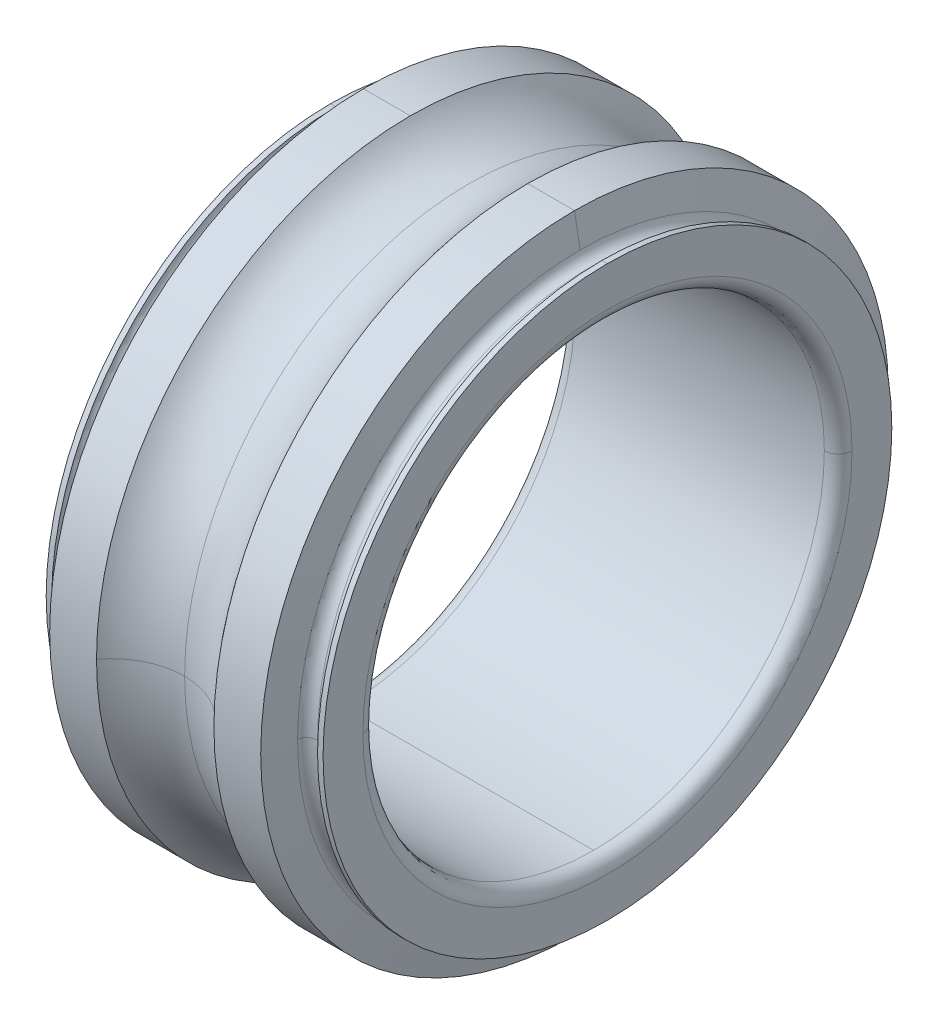
ISO-10303-21;
HEADER;
FILE_DESCRIPTION(('STEP AP214'),'2;1');
FILE_NAME('part.step','',(''),(''),'','','');
FILE_SCHEMA(('AUTOMOTIVE_DESIGN { 1 0 10303 214 1 1 1 1 }'));
ENDSEC;
DATA;
#1=APPLICATION_CONTEXT('core data for automotive mechanical design processes');
#2=APPLICATION_PROTOCOL_DEFINITION('international standard','automotive_design',2000,#1);
#3=PRODUCT_CONTEXT('',#1,'mechanical');
#4=PRODUCT('Part','Part','',(#3));
#5=PRODUCT_RELATED_PRODUCT_CATEGORY('part','',(#4));
#6=PRODUCT_DEFINITION_FORMATION('','',#4);
#7=PRODUCT_DEFINITION_CONTEXT('part definition',#1,'design');
#8=PRODUCT_DEFINITION('design','',#6,#7);
#9=PRODUCT_DEFINITION_SHAPE('','',#8);
#10=(LENGTH_UNIT() NAMED_UNIT(*) SI_UNIT(.MILLI.,.METRE.));
#11=(NAMED_UNIT(*) PLANE_ANGLE_UNIT() SI_UNIT($,.RADIAN.));
#12=(NAMED_UNIT(*) SI_UNIT($,.STERADIAN.) SOLID_ANGLE_UNIT());
#13=UNCERTAINTY_MEASURE_WITH_UNIT(LENGTH_MEASURE(1.E-05),#10,'distance_accuracy_value','');
#14=(GEOMETRIC_REPRESENTATION_CONTEXT(3) GLOBAL_UNCERTAINTY_ASSIGNED_CONTEXT((#13)) GLOBAL_UNIT_ASSIGNED_CONTEXT((#10,
#11,#12)) REPRESENTATION_CONTEXT('',''));
#15=CARTESIAN_POINT('',(0.,0.,0.));
#16=DIRECTION('',(0.,0.,1.));
#17=DIRECTION('',(1.,0.,0.));
#18=AXIS2_PLACEMENT_3D('',#15,#16,#17);
#19=CARTESIAN_POINT('',(9.55827575048552,0.,0.));
#20=DIRECTION('',(1.,0.,0.));
#21=DIRECTION('',(0.,1.,0.));
#22=AXIS2_PLACEMENT_3D('',#19,#20,#21);
#23=CYLINDRICAL_SURFACE('',#22,13.6);
#24=DIRECTION('',(1.,0.,0.));
#25=VECTOR('',#24,1.);
#26=CARTESIAN_POINT('',(9.55827575048552,13.6,0.));
#27=LINE('',#26,#25);
#28=CARTESIAN_POINT('',(8.54374232185572,13.6,0.));
#29=VERTEX_POINT('',#28);
#30=CARTESIAN_POINT('',(10.5728091791153,13.6,0.));
#31=VERTEX_POINT('',#30);
#32=EDGE_CURVE('E295',#29,#31,#27,.T.);
#33=ORIENTED_EDGE('',*,*,#32,.T.);
#34=CARTESIAN_POINT('',(10.5728091791153,0.,0.));
#35=DIRECTION('',(1.,0.,0.));
#36=DIRECTION('',(0.,1.,0.));
#37=AXIS2_PLACEMENT_3D('',#34,#35,#36);
#38=CIRCLE('',#37,13.6);
#39=CARTESIAN_POINT('',(10.5728091791153,-13.6,0.));
#40=VERTEX_POINT('',#39);
#41=EDGE_CURVE('E229',#40,#31,#38,.T.);
#42=ORIENTED_EDGE('',*,*,#41,.F.);
#43=DIRECTION('',(-1.,0.,0.));
#44=VECTOR('',#43,1.);
#45=CARTESIAN_POINT('',(9.55827575048552,-13.6,0.));
#46=LINE('',#45,#44);
#47=CARTESIAN_POINT('',(8.54374232185572,-13.6,0.));
#48=VERTEX_POINT('',#47);
#49=EDGE_CURVE('E298',#40,#48,#46,.T.);
#50=ORIENTED_EDGE('',*,*,#49,.T.);
#51=CARTESIAN_POINT('',(8.54374232185572,0.,0.));
#52=DIRECTION('',(1.,0.,0.));
#53=DIRECTION('',(0.,1.,0.));
#54=AXIS2_PLACEMENT_3D('',#51,#52,#53);
#55=CIRCLE('',#54,13.6);
#56=CARTESIAN_POINT('',(8.54374232185572,0.,-13.6));
#57=VERTEX_POINT('',#56);
#58=EDGE_CURVE('E205',#48,#57,#55,.T.);
#59=ORIENTED_EDGE('',*,*,#58,.T.);
#60=CARTESIAN_POINT('',(8.54374232185572,0.,0.));
#61=DIRECTION('',(1.,0.,0.));
#62=DIRECTION('',(0.,1.,0.));
#63=AXIS2_PLACEMENT_3D('',#60,#61,#62);
#64=CIRCLE('',#63,13.6);
#65=EDGE_CURVE('E236',#57,#29,#64,.T.);
#66=ORIENTED_EDGE('',*,*,#65,.T.);
#67=EDGE_LOOP('',(#33,#42,#50,#59,#66));
#68=FACE_BOUND('',#67,.T.);
#69=ADVANCED_FACE('F16',(#68),#23,.T.);
#70=CARTESIAN_POINT('',(6.,0.,0.));
#71=DIRECTION('',(1.,0.,0.));
#72=DIRECTION('',(0.,0.,-1.));
#73=AXIS2_PLACEMENT_3D('',#70,#71,#72);
#74=TOROIDAL_SURFACE('',#73,15.5,3.175);
#75=CARTESIAN_POINT('',(6.,0.,0.));
#76=DIRECTION('',(-1.,0.,0.));
#77=DIRECTION('',(0.,0.,1.));
#78=AXIS2_PLACEMENT_3D('',#75,#76,#77);
#79=CIRCLE('',#78,12.325);
#80=CARTESIAN_POINT('',(6.,0.,12.325));
#81=VERTEX_POINT('',#80);
#82=CARTESIAN_POINT('',(6.,0.,-12.325));
#83=VERTEX_POINT('',#82);
#84=EDGE_CURVE('E187',#81,#83,#79,.T.);
#85=ORIENTED_EDGE('',*,*,#84,.T.);
#86=CARTESIAN_POINT('',(6.,0.,-15.5));
#87=DIRECTION('',(0.,-1.,0.));
#88=DIRECTION('',(0.,0.,-1.));
#89=AXIS2_PLACEMENT_3D('',#86,#87,#88);
#90=CIRCLE('',#89,3.175);
#91=CARTESIAN_POINT('',(3.45625767814427,0.,-13.6));
#92=VERTEX_POINT('',#91);
#93=EDGE_CURVE('E201',#83,#92,#90,.T.);
#94=ORIENTED_EDGE('',*,*,#93,.T.);
#95=CARTESIAN_POINT('',(3.45625767814427,0.,0.));
#96=DIRECTION('',(1.,0.,0.));
#97=DIRECTION('',(0.,1.,0.));
#98=AXIS2_PLACEMENT_3D('',#95,#96,#97);
#99=CIRCLE('',#98,13.6);
#100=CARTESIAN_POINT('',(3.45625767814427,13.6,0.));
#101=VERTEX_POINT('',#100);
#102=EDGE_CURVE('E11',#92,#101,#99,.T.);
#103=ORIENTED_EDGE('',*,*,#102,.T.);
#104=CARTESIAN_POINT('',(3.45625767814427,0.,0.));
#105=DIRECTION('',(1.,0.,0.));
#106=DIRECTION('',(0.,1.,0.));
#107=AXIS2_PLACEMENT_3D('',#104,#105,#106);
#108=CIRCLE('',#107,13.6);
#109=CARTESIAN_POINT('',(3.45625767814427,0.,13.6));
#110=VERTEX_POINT('',#109);
#111=EDGE_CURVE('E189',#101,#110,#108,.T.);
#112=ORIENTED_EDGE('',*,*,#111,.T.);
#113=CARTESIAN_POINT('',(6.,0.,15.5));
#114=DIRECTION('',(0.,-1.,0.));
#115=DIRECTION('',(0.,0.,1.));
#116=AXIS2_PLACEMENT_3D('',#113,#114,#115);
#117=CIRCLE('',#116,3.175);
#118=EDGE_CURVE('E182',#110,#81,#117,.T.);
#119=ORIENTED_EDGE('',*,*,#118,.T.);
#120=EDGE_LOOP('',(#85,#94,#103,#112,#119));
#121=FACE_BOUND('',#120,.T.);
#122=ADVANCED_FACE('F184',(#121),#74,.F.);
#123=CARTESIAN_POINT('',(2.44172424951447,0.,0.));
#124=DIRECTION('',(1.,0.,0.));
#125=DIRECTION('',(0.,1.,0.));
#126=AXIS2_PLACEMENT_3D('',#123,#124,#125);
#127=CYLINDRICAL_SURFACE('',#126,13.6);
#128=DIRECTION('',(1.,0.,0.));
#129=VECTOR('',#128,1.);
#130=CARTESIAN_POINT('',(2.44172424951447,13.6,0.));
#131=LINE('',#130,#129);
#132=CARTESIAN_POINT('',(1.42719082088468,13.6,0.));
#133=VERTEX_POINT('',#132);
#134=EDGE_CURVE('E319',#133,#101,#131,.T.);
#135=ORIENTED_EDGE('',*,*,#134,.T.);
#136=ORIENTED_EDGE('',*,*,#102,.F.);
#137=CARTESIAN_POINT('',(3.45625767814427,0.,0.));
#138=DIRECTION('',(1.,0.,0.));
#139=DIRECTION('',(0.,1.,0.));
#140=AXIS2_PLACEMENT_3D('',#137,#138,#139);
#141=CIRCLE('',#140,13.6);
#142=CARTESIAN_POINT('',(3.45625767814427,-13.6,0.));
#143=VERTEX_POINT('',#142);
#144=EDGE_CURVE('E309',#143,#92,#141,.T.);
#145=ORIENTED_EDGE('',*,*,#144,.F.);
#146=DIRECTION('',(-1.,0.,0.));
#147=VECTOR('',#146,1.);
#148=CARTESIAN_POINT('',(2.44172424951447,-13.6,0.));
#149=LINE('',#148,#147);
#150=CARTESIAN_POINT('',(1.42719082088468,-13.6,0.));
#151=VERTEX_POINT('',#150);
#152=EDGE_CURVE('E325',#143,#151,#149,.T.);
#153=ORIENTED_EDGE('',*,*,#152,.T.);
#154=CARTESIAN_POINT('',(1.42719082088468,0.,0.));
#155=DIRECTION('',(1.,0.,0.));
#156=DIRECTION('',(0.,1.,0.));
#157=AXIS2_PLACEMENT_3D('',#154,#155,#156);
#158=CIRCLE('',#157,13.6);
#159=EDGE_CURVE('E24',#151,#133,#158,.T.);
#160=ORIENTED_EDGE('',*,*,#159,.T.);
#161=EDGE_LOOP('',(#135,#136,#145,#153,#160));
#162=FACE_BOUND('',#161,.T.);
#163=ADVANCED_FACE('F433',(#162),#127,.T.);
#164=CARTESIAN_POINT('',(1.30746446341226,0.,0.));
#165=DIRECTION('',(1.,0.,0.));
#166=DIRECTION('',(0.,1.,0.));
#167=AXIS2_PLACEMENT_3D('',#164,#165,#166);
#168=CONICAL_SURFACE('',#167,12.9209980855376,1.39626340159546);
#169=DIRECTION('',(0.17364817766693,0.984807753012208,0.));
#170=VECTOR('',#169,1.);
#171=CARTESIAN_POINT('',(1.30746446341226,12.9209980855376,0.));
#172=LINE('',#171,#170);
#173=CARTESIAN_POINT('',(1.18773810593984,12.2419961710752,0.));
#174=VERTEX_POINT('',#173);
#175=EDGE_CURVE('E334',#174,#133,#172,.T.);
#176=ORIENTED_EDGE('',*,*,#175,.T.);
#177=ORIENTED_EDGE('',*,*,#159,.F.);
#178=DIRECTION('',(-0.17364817766693,0.984807753012208,0.));
#179=VECTOR('',#178,1.);
#180=CARTESIAN_POINT('',(1.30746446341226,-12.9209980855376,0.));
#181=LINE('',#180,#179);
#182=CARTESIAN_POINT('',(1.18773810593984,-12.2419961710752,0.));
#183=VERTEX_POINT('',#182);
#184=EDGE_CURVE('E337',#151,#183,#181,.T.);
#185=ORIENTED_EDGE('',*,*,#184,.T.);
#186=CARTESIAN_POINT('',(1.18773810593984,0.,0.));
#187=DIRECTION('',(1.,0.,0.));
#188=DIRECTION('',(0.,1.,0.));
#189=AXIS2_PLACEMENT_3D('',#186,#187,#188);
#190=CIRCLE('',#189,12.2419961710752);
#191=CARTESIAN_POINT('',(1.18773810593984,0.,-12.2419961710752));
#192=VERTEX_POINT('',#191);
#193=EDGE_CURVE('E276',#183,#192,#190,.T.);
#194=ORIENTED_EDGE('',*,*,#193,.T.);
#195=CARTESIAN_POINT('',(1.18773810593984,0.,0.));
#196=DIRECTION('',(1.,0.,0.));
#197=DIRECTION('',(0.,1.,0.));
#198=AXIS2_PLACEMENT_3D('',#195,#196,#197);
#199=CIRCLE('',#198,12.2419961710752);
#200=EDGE_CURVE('E258',#192,#174,#199,.T.);
#201=ORIENTED_EDGE('',*,*,#200,.T.);
#202=EDGE_LOOP('',(#176,#177,#185,#194,#201));
#203=FACE_BOUND('',#202,.T.);
#204=ADVANCED_FACE('F426',(#203),#168,.T.);
#205=CARTESIAN_POINT('',(0.717,0.,0.));
#206=DIRECTION('',(1.,0.,0.));
#207=DIRECTION('',(0.,0.,-1.));
#208=AXIS2_PLACEMENT_3D('',#205,#206,#207);
#209=TOROIDAL_SURFACE('',#208,12.325,0.478);
#210=CARTESIAN_POINT('',(0.717,0.,0.));
#211=DIRECTION('',(-1.,0.,0.));
#212=DIRECTION('',(0.,0.,1.));
#213=AXIS2_PLACEMENT_3D('',#210,#211,#212);
#214=CIRCLE('',#213,11.847);
#215=CARTESIAN_POINT('',(0.717,0.,11.847));
#216=VERTEX_POINT('',#215);
#217=CARTESIAN_POINT('',(0.717,0.,-11.847));
#218=VERTEX_POINT('',#217);
#219=EDGE_CURVE('E249',#216,#218,#214,.T.);
#220=ORIENTED_EDGE('',*,*,#219,.T.);
#221=CARTESIAN_POINT('',(0.717,0.,-12.325));
#222=DIRECTION('',(0.,-1.,0.));
#223=DIRECTION('',(0.,0.,-1.));
#224=AXIS2_PLACEMENT_3D('',#221,#222,#223);
#225=CIRCLE('',#224,0.478);
#226=CARTESIAN_POINT('',(0.239,0.,-12.325));
#227=VERTEX_POINT('',#226);
#228=EDGE_CURVE('E351',#218,#227,#225,.T.);
#229=ORIENTED_EDGE('',*,*,#228,.T.);
#230=CARTESIAN_POINT('',(0.239,0.,0.));
#231=DIRECTION('',(1.,0.,0.));
#232=DIRECTION('',(0.,1.,0.));
#233=AXIS2_PLACEMENT_3D('',#230,#231,#232);
#234=CIRCLE('',#233,12.325);
#235=CARTESIAN_POINT('',(0.239,12.325,0.));
#236=VERTEX_POINT('',#235);
#237=EDGE_CURVE('E19',#227,#236,#234,.T.);
#238=ORIENTED_EDGE('',*,*,#237,.T.);
#239=CARTESIAN_POINT('',(0.239,0.,0.));
#240=DIRECTION('',(1.,0.,0.));
#241=DIRECTION('',(0.,1.,0.));
#242=AXIS2_PLACEMENT_3D('',#239,#240,#241);
#243=CIRCLE('',#242,12.325);
#244=CARTESIAN_POINT('',(0.239,0.,12.325));
#245=VERTEX_POINT('',#244);
#246=EDGE_CURVE('E363',#236,#245,#243,.T.);
#247=ORIENTED_EDGE('',*,*,#246,.T.);
#248=CARTESIAN_POINT('',(0.717,0.,12.325));
#249=DIRECTION('',(0.,-1.,0.));
#250=DIRECTION('',(0.,0.,1.));
#251=AXIS2_PLACEMENT_3D('',#248,#249,#250);
#252=CIRCLE('',#251,0.478);
#253=EDGE_CURVE('E339',#245,#216,#252,.T.);
#254=ORIENTED_EDGE('',*,*,#253,.T.);
#255=EDGE_LOOP('',(#220,#229,#238,#247,#254));
#256=FACE_BOUND('',#255,.T.);
#257=ADVANCED_FACE('F407',(#256),#209,.F.);
#258=CARTESIAN_POINT('',(0.1195,0.,0.));
#259=DIRECTION('',(1.,0.,0.));
#260=DIRECTION('',(0.,1.,0.));
#261=AXIS2_PLACEMENT_3D('',#258,#259,#260);
#262=CYLINDRICAL_SURFACE('',#261,12.325);
#263=DIRECTION('',(1.,0.,0.));
#264=VECTOR('',#263,1.);
#265=CARTESIAN_POINT('',(0.1195,12.325,0.));
#266=LINE('',#265,#264);
#267=CARTESIAN_POINT('',(0.,12.325,0.));
#268=VERTEX_POINT('',#267);
#269=EDGE_CURVE('E354',#268,#236,#266,.T.);
#270=ORIENTED_EDGE('',*,*,#269,.T.);
#271=ORIENTED_EDGE('',*,*,#237,.F.);
#272=CARTESIAN_POINT('',(0.239,0.,0.));
#273=DIRECTION('',(1.,0.,0.));
#274=DIRECTION('',(0.,1.,0.));
#275=AXIS2_PLACEMENT_3D('',#272,#273,#274);
#276=CIRCLE('',#275,12.325);
#277=CARTESIAN_POINT('',(0.239,-12.325,0.));
#278=VERTEX_POINT('',#277);
#279=EDGE_CURVE('E347',#278,#227,#276,.T.);
#280=ORIENTED_EDGE('',*,*,#279,.F.);
#281=DIRECTION('',(-1.,0.,0.));
#282=VECTOR('',#281,1.);
#283=CARTESIAN_POINT('',(0.1195,-12.325,0.));
#284=LINE('',#283,#282);
#285=CARTESIAN_POINT('',(0.,-12.325,0.));
#286=VERTEX_POINT('',#285);
#287=EDGE_CURVE('E360',#278,#286,#284,.T.);
#288=ORIENTED_EDGE('',*,*,#287,.T.);
#289=CARTESIAN_POINT('',(0.,0.,0.));
#290=DIRECTION('',(1.,0.,0.));
#291=DIRECTION('',(0.,1.,0.));
#292=AXIS2_PLACEMENT_3D('',#289,#290,#291);
#293=CIRCLE('',#292,12.325);
#294=EDGE_CURVE('E376',#286,#268,#293,.T.);
#295=ORIENTED_EDGE('',*,*,#294,.T.);
#296=EDGE_LOOP('',(#270,#271,#280,#288,#295));
#297=FACE_BOUND('',#296,.T.);
#298=ADVANCED_FACE('F414',(#297),#262,.T.);
#299=CARTESIAN_POINT('',(0.,11.4625,0.));
#300=DIRECTION('',(-1.,0.,0.));
#301=DIRECTION('',(0.,0.,1.));
#302=AXIS2_PLACEMENT_3D('',#299,#300,#301);
#303=PLANE('',#302);
#304=CARTESIAN_POINT('',(0.,0.,0.));
#305=DIRECTION('',(1.,0.,0.));
#306=DIRECTION('',(0.,1.,0.));
#307=AXIS2_PLACEMENT_3D('',#304,#305,#306);
#308=CIRCLE('',#307,10.6);
#309=CARTESIAN_POINT('',(0.,0.,10.6));
#310=VERTEX_POINT('',#309);
#311=CARTESIAN_POINT('',(0.,0.,-10.6));
#312=VERTEX_POINT('',#311);
#313=EDGE_CURVE('E371',#310,#312,#308,.T.);
#314=ORIENTED_EDGE('',*,*,#313,.T.);
#315=CARTESIAN_POINT('',(0.,0.,0.));
#316=DIRECTION('',(1.,0.,0.));
#317=DIRECTION('',(0.,1.,0.));
#318=AXIS2_PLACEMENT_3D('',#315,#316,#317);
#319=CIRCLE('',#318,10.6);
#320=EDGE_CURVE('E282',#312,#310,#319,.T.);
#321=ORIENTED_EDGE('',*,*,#320,.T.);
#322=EDGE_LOOP('',(#314,#321));
#323=FACE_BOUND('',#322,.T.);
#324=CARTESIAN_POINT('',(0.,0.,0.));
#325=DIRECTION('',(1.,0.,0.));
#326=DIRECTION('',(0.,1.,0.));
#327=AXIS2_PLACEMENT_3D('',#324,#325,#326);
#328=CIRCLE('',#327,12.325);
#329=EDGE_CURVE('E357',#268,#286,#328,.T.);
#330=ORIENTED_EDGE('',*,*,#329,.F.);
#331=ORIENTED_EDGE('',*,*,#294,.F.);
#332=EDGE_LOOP('',(#330,#331));
#333=FACE_BOUND('',#332,.T.);
#334=ADVANCED_FACE('F416',(#323,#333),#303,.T.);
#335=CARTESIAN_POINT('',(0.6,0.,0.));
#336=DIRECTION('',(1.,0.,0.));
#337=DIRECTION('',(0.,0.,-1.));
#338=AXIS2_PLACEMENT_3D('',#335,#336,#337);
#339=TOROIDAL_SURFACE('',#338,10.6,0.6);
#340=CARTESIAN_POINT('',(0.6,0.,-10.6));
#341=DIRECTION('',(0.,-1.,0.));
#342=DIRECTION('',(0.,0.,-1.));
#343=AXIS2_PLACEMENT_3D('',#340,#341,#342);
#344=CIRCLE('',#343,0.6);
#345=CARTESIAN_POINT('',(0.6,0.,-10.));
#346=VERTEX_POINT('',#345);
#347=EDGE_CURVE('E369',#346,#312,#344,.T.);
#348=ORIENTED_EDGE('',*,*,#347,.T.);
#349=ORIENTED_EDGE('',*,*,#313,.F.);
#350=CARTESIAN_POINT('',(0.6,0.,10.6));
#351=DIRECTION('',(0.,-1.,0.));
#352=DIRECTION('',(0.,0.,1.));
#353=AXIS2_PLACEMENT_3D('',#350,#351,#352);
#354=CIRCLE('',#353,0.6);
#355=CARTESIAN_POINT('',(0.6,0.,10.));
#356=VERTEX_POINT('',#355);
#357=EDGE_CURVE('E382',#310,#356,#354,.T.);
#358=ORIENTED_EDGE('',*,*,#357,.T.);
#359=CARTESIAN_POINT('',(0.6,0.,0.));
#360=DIRECTION('',(1.,0.,0.));
#361=DIRECTION('',(0.,1.,0.));
#362=AXIS2_PLACEMENT_3D('',#359,#360,#361);
#363=CIRCLE('',#362,10.);
#364=CARTESIAN_POINT('',(0.6,-10.,0.));
#365=VERTEX_POINT('',#364);
#366=EDGE_CURVE('E366',#356,#365,#363,.T.);
#367=ORIENTED_EDGE('',*,*,#366,.T.);
#368=CARTESIAN_POINT('',(0.6,0.,0.));
#369=DIRECTION('',(1.,0.,0.));
#370=DIRECTION('',(0.,1.,0.));
#371=AXIS2_PLACEMENT_3D('',#368,#369,#370);
#372=CIRCLE('',#371,10.);
#373=EDGE_CURVE('E281',#365,#346,#372,.T.);
#374=ORIENTED_EDGE('',*,*,#373,.T.);
#375=EDGE_LOOP('',(#348,#349,#358,#367,#374));
#376=FACE_BOUND('',#375,.T.);
#377=ADVANCED_FACE('F423',(#376),#339,.T.);
#378=CARTESIAN_POINT('',(6.,0.,0.));
#379=DIRECTION('',(1.,0.,0.));
#380=DIRECTION('',(0.,1.,0.));
#381=AXIS2_PLACEMENT_3D('',#378,#379,#380);
#382=CYLINDRICAL_SURFACE('',#381,10.);
#383=DIRECTION('',(1.,0.,0.));
#384=VECTOR('',#383,1.);
#385=CARTESIAN_POINT('',(6.,10.,0.));
#386=LINE('',#385,#384);
#387=CARTESIAN_POINT('',(0.6,10.,0.));
#388=VERTEX_POINT('',#387);
#389=CARTESIAN_POINT('',(11.4,10.,0.));
#390=VERTEX_POINT('',#389);
#391=EDGE_CURVE('E278',#388,#390,#386,.T.);
#392=ORIENTED_EDGE('',*,*,#391,.T.);
#393=CARTESIAN_POINT('',(11.4,0.,0.));
#394=DIRECTION('',(1.,0.,0.));
#395=DIRECTION('',(0.,1.,0.));
#396=AXIS2_PLACEMENT_3D('',#393,#394,#395);
#397=CIRCLE('',#396,10.);
#398=CARTESIAN_POINT('',(11.4,0.,10.));
#399=VERTEX_POINT('',#398);
#400=EDGE_CURVE('E314',#390,#399,#397,.T.);
#401=ORIENTED_EDGE('',*,*,#400,.T.);
#402=CARTESIAN_POINT('',(11.4,0.,0.));
#403=DIRECTION('',(1.,0.,0.));
#404=DIRECTION('',(0.,1.,0.));
#405=AXIS2_PLACEMENT_3D('',#402,#403,#404);
#406=CIRCLE('',#405,10.);
#407=CARTESIAN_POINT('',(11.4,-10.,0.));
#408=VERTEX_POINT('',#407);
#409=EDGE_CURVE('E364',#399,#408,#406,.T.);
#410=ORIENTED_EDGE('',*,*,#409,.T.);
#411=DIRECTION('',(-1.,0.,0.));
#412=VECTOR('',#411,1.);
#413=CARTESIAN_POINT('',(6.,-10.,0.));
#414=LINE('',#413,#412);
#415=EDGE_CURVE('E286',#408,#365,#414,.T.);
#416=ORIENTED_EDGE('',*,*,#415,.T.);
#417=ORIENTED_EDGE('',*,*,#366,.F.);
#418=CARTESIAN_POINT('',(0.6,0.,0.));
#419=DIRECTION('',(1.,0.,0.));
#420=DIRECTION('',(0.,1.,0.));
#421=AXIS2_PLACEMENT_3D('',#418,#419,#420);
#422=CIRCLE('',#421,10.);
#423=EDGE_CURVE('E379',#388,#356,#422,.T.);
#424=ORIENTED_EDGE('',*,*,#423,.F.);
#425=EDGE_LOOP('',(#392,#401,#410,#416,#417,#424));
#426=FACE_BOUND('',#425,.T.);
#427=ADVANCED_FACE('F475',(#426),#382,.F.);
#428=CARTESIAN_POINT('',(11.4,0.,0.));
#429=DIRECTION('',(1.,0.,0.));
#430=DIRECTION('',(0.,0.,-1.));
#431=AXIS2_PLACEMENT_3D('',#428,#429,#430);
#432=TOROIDAL_SURFACE('',#431,10.6,0.6);
#433=CARTESIAN_POINT('',(11.4,0.,-10.6));
#434=DIRECTION('',(0.,-1.,0.));
#435=DIRECTION('',(0.,0.,-1.));
#436=AXIS2_PLACEMENT_3D('',#433,#434,#435);
#437=CIRCLE('',#436,0.6);
#438=CARTESIAN_POINT('',(12.,0.,-10.6));
#439=VERTEX_POINT('',#438);
#440=CARTESIAN_POINT('',(11.4,0.,-10.));
#441=VERTEX_POINT('',#440);
#442=EDGE_CURVE('E299',#439,#441,#437,.T.);
#443=ORIENTED_EDGE('',*,*,#442,.T.);
#444=CARTESIAN_POINT('',(11.4,0.,0.));
#445=DIRECTION('',(1.,0.,0.));
#446=DIRECTION('',(0.,1.,0.));
#447=AXIS2_PLACEMENT_3D('',#444,#445,#446);
#448=CIRCLE('',#447,10.);
#449=EDGE_CURVE('E289',#408,#441,#448,.T.);
#450=ORIENTED_EDGE('',*,*,#449,.F.);
#451=ORIENTED_EDGE('',*,*,#409,.F.);
#452=CARTESIAN_POINT('',(11.4,0.,10.6));
#453=DIRECTION('',(0.,-1.,0.));
#454=DIRECTION('',(0.,0.,1.));
#455=AXIS2_PLACEMENT_3D('',#452,#453,#454);
#456=CIRCLE('',#455,0.6);
#457=CARTESIAN_POINT('',(12.,0.,10.6));
#458=VERTEX_POINT('',#457);
#459=EDGE_CURVE('E305',#399,#458,#456,.T.);
#460=ORIENTED_EDGE('',*,*,#459,.T.);
#461=CARTESIAN_POINT('',(12.,0.,0.));
#462=DIRECTION('',(1.,0.,0.));
#463=DIRECTION('',(0.,1.,0.));
#464=AXIS2_PLACEMENT_3D('',#461,#462,#463);
#465=CIRCLE('',#464,10.6);
#466=EDGE_CURVE('E367',#458,#439,#465,.T.);
#467=ORIENTED_EDGE('',*,*,#466,.T.);
#468=EDGE_LOOP('',(#443,#450,#451,#460,#467));
#469=FACE_BOUND('',#468,.T.);
#470=ADVANCED_FACE('F467',(#469),#432,.T.);
#471=CARTESIAN_POINT('',(12.,11.4625,0.));
#472=DIRECTION('',(1.,0.,0.));
#473=DIRECTION('',(0.,1.,0.));
#474=AXIS2_PLACEMENT_3D('',#471,#472,#473);
#475=PLANE('',#474);
#476=CARTESIAN_POINT('',(12.,0.,0.));
#477=DIRECTION('',(1.,0.,0.));
#478=DIRECTION('',(0.,1.,0.));
#479=AXIS2_PLACEMENT_3D('',#476,#477,#478);
#480=CIRCLE('',#479,10.6);
#481=EDGE_CURVE('E301',#439,#458,#480,.T.);
#482=ORIENTED_EDGE('',*,*,#481,.F.);
#483=ORIENTED_EDGE('',*,*,#466,.F.);
#484=EDGE_LOOP('',(#482,#483));
#485=FACE_BOUND('',#484,.T.);
#486=CARTESIAN_POINT('',(12.,0.,0.));
#487=DIRECTION('',(1.,0.,0.));
#488=DIRECTION('',(0.,1.,0.));
#489=AXIS2_PLACEMENT_3D('',#486,#487,#488);
#490=CIRCLE('',#489,12.325);
#491=CARTESIAN_POINT('',(12.,12.325,0.));
#492=VERTEX_POINT('',#491);
#493=CARTESIAN_POINT('',(12.,-12.325,0.));
#494=VERTEX_POINT('',#493);
#495=EDGE_CURVE('E317',#492,#494,#490,.T.);
#496=ORIENTED_EDGE('',*,*,#495,.T.);
#497=CARTESIAN_POINT('',(12.,0.,0.));
#498=DIRECTION('',(1.,0.,0.));
#499=DIRECTION('',(0.,1.,0.));
#500=AXIS2_PLACEMENT_3D('',#497,#498,#499);
#501=CIRCLE('',#500,12.325);
#502=EDGE_CURVE('E230',#494,#492,#501,.T.);
#503=ORIENTED_EDGE('',*,*,#502,.T.);
#504=EDGE_LOOP('',(#496,#503));
#505=FACE_BOUND('',#504,.T.);
#506=ADVANCED_FACE('F465',(#485,#505),#475,.T.);
#507=CARTESIAN_POINT('',(11.8805,0.,0.));
#508=DIRECTION('',(1.,0.,0.));
#509=DIRECTION('',(0.,1.,0.));
#510=AXIS2_PLACEMENT_3D('',#507,#508,#509);
#511=CYLINDRICAL_SURFACE('',#510,12.325);
#512=DIRECTION('',(1.,0.,0.));
#513=VECTOR('',#512,1.);
#514=CARTESIAN_POINT('',(11.8805,12.325,0.));
#515=LINE('',#514,#513);
#516=CARTESIAN_POINT('',(11.761,12.325,0.));
#517=VERTEX_POINT('',#516);
#518=EDGE_CURVE('E310',#517,#492,#515,.T.);
#519=ORIENTED_EDGE('',*,*,#518,.T.);
#520=ORIENTED_EDGE('',*,*,#502,.F.);
#521=DIRECTION('',(-1.,0.,0.));
#522=VECTOR('',#521,1.);
#523=CARTESIAN_POINT('',(11.8805,-12.325,0.));
#524=LINE('',#523,#522);
#525=CARTESIAN_POINT('',(11.761,-12.325,0.));
#526=VERTEX_POINT('',#525);
#527=EDGE_CURVE('E313',#494,#526,#524,.T.);
#528=ORIENTED_EDGE('',*,*,#527,.T.);
#529=CARTESIAN_POINT('',(11.761,0.,0.));
#530=DIRECTION('',(1.,0.,0.));
#531=DIRECTION('',(0.,1.,0.));
#532=AXIS2_PLACEMENT_3D('',#529,#530,#531);
#533=CIRCLE('',#532,12.325);
#534=CARTESIAN_POINT('',(11.761,0.,-12.325));
#535=VERTEX_POINT('',#534);
#536=EDGE_CURVE('E268',#526,#535,#533,.T.);
#537=ORIENTED_EDGE('',*,*,#536,.T.);
#538=CARTESIAN_POINT('',(11.761,0.,0.));
#539=DIRECTION('',(1.,0.,0.));
#540=DIRECTION('',(0.,1.,0.));
#541=AXIS2_PLACEMENT_3D('',#538,#539,#540);
#542=CIRCLE('',#541,12.325);
#543=EDGE_CURVE('E227',#535,#517,#542,.T.);
#544=ORIENTED_EDGE('',*,*,#543,.T.);
#545=EDGE_LOOP('',(#519,#520,#528,#537,#544));
#546=FACE_BOUND('',#545,.T.);
#547=ADVANCED_FACE('F463',(#546),#511,.T.);
#548=CARTESIAN_POINT('',(11.283,0.,0.));
#549=DIRECTION('',(1.,0.,0.));
#550=DIRECTION('',(0.,0.,-1.));
#551=AXIS2_PLACEMENT_3D('',#548,#549,#550);
#552=TOROIDAL_SURFACE('',#551,12.325,0.478);
#553=CARTESIAN_POINT('',(11.283,0.,0.));
#554=DIRECTION('',(-1.,0.,0.));
#555=DIRECTION('',(0.,0.,1.));
#556=AXIS2_PLACEMENT_3D('',#553,#554,#555);
#557=CIRCLE('',#556,11.847);
#558=CARTESIAN_POINT('',(11.283,0.,11.847));
#559=VERTEX_POINT('',#558);
#560=CARTESIAN_POINT('',(11.283,0.,-11.847));
#561=VERTEX_POINT('',#560);
#562=EDGE_CURVE('E247',#559,#561,#557,.T.);
#563=ORIENTED_EDGE('',*,*,#562,.T.);
#564=CARTESIAN_POINT('',(11.283,0.,-12.325));
#565=DIRECTION('',(0.,-1.,0.));
#566=DIRECTION('',(0.,0.,-1.));
#567=AXIS2_PLACEMENT_3D('',#564,#565,#566);
#568=CIRCLE('',#567,0.478);
#569=CARTESIAN_POINT('',(10.8122618940602,0.,-12.2419961710752));
#570=VERTEX_POINT('',#569);
#571=EDGE_CURVE('E331',#561,#570,#568,.T.);
#572=ORIENTED_EDGE('',*,*,#571,.T.);
#573=CARTESIAN_POINT('',(10.8122618940602,0.,0.));
#574=DIRECTION('',(1.,0.,0.));
#575=DIRECTION('',(0.,1.,0.));
#576=AXIS2_PLACEMENT_3D('',#573,#574,#575);
#577=CIRCLE('',#576,12.2419961710752);
#578=CARTESIAN_POINT('',(10.8122618940602,12.2419961710752,0.));
#579=VERTEX_POINT('',#578);
#580=EDGE_CURVE('E32',#570,#579,#577,.T.);
#581=ORIENTED_EDGE('',*,*,#580,.T.);
#582=CARTESIAN_POINT('',(10.8122618940602,0.,0.));
#583=DIRECTION('',(1.,0.,0.));
#584=DIRECTION('',(0.,1.,0.));
#585=AXIS2_PLACEMENT_3D('',#582,#583,#584);
#586=CIRCLE('',#585,12.2419961710752);
#587=CARTESIAN_POINT('',(10.8122618940602,0.,12.2419961710752));
#588=VERTEX_POINT('',#587);
#589=EDGE_CURVE('E240',#579,#588,#586,.T.);
#590=ORIENTED_EDGE('',*,*,#589,.T.);
#591=CARTESIAN_POINT('',(11.283,0.,12.325));
#592=DIRECTION('',(0.,-1.,0.));
#593=DIRECTION('',(0.,0.,1.));
#594=AXIS2_PLACEMENT_3D('',#591,#592,#593);
#595=CIRCLE('',#594,0.478);
#596=EDGE_CURVE('E396',#588,#559,#595,.T.);
#597=ORIENTED_EDGE('',*,*,#596,.T.);
#598=EDGE_LOOP('',(#563,#572,#581,#590,#597));
#599=FACE_BOUND('',#598,.T.);
#600=ADVANCED_FACE('F448',(#599),#552,.F.);
#601=CARTESIAN_POINT('',(10.6925355365877,0.,0.));
#602=DIRECTION('',(-1.,0.,0.));
#603=DIRECTION('',(0.,1.,0.));
#604=AXIS2_PLACEMENT_3D('',#601,#602,#603);
#605=CONICAL_SURFACE('',#604,12.9209980855376,1.39626340159546);
#606=DIRECTION('',(0.17364817766693,-0.984807753012208,0.));
#607=VECTOR('',#606,1.);
#608=CARTESIAN_POINT('',(10.6925355365877,12.9209980855376,0.));
#609=LINE('',#608,#607);
#610=EDGE_CURVE('E342',#31,#579,#609,.T.);
#611=ORIENTED_EDGE('',*,*,#610,.T.);
#612=ORIENTED_EDGE('',*,*,#580,.F.);
#613=CARTESIAN_POINT('',(10.8122618940602,0.,0.));
#614=DIRECTION('',(1.,0.,0.));
#615=DIRECTION('',(0.,1.,0.));
#616=AXIS2_PLACEMENT_3D('',#613,#614,#615);
#617=CIRCLE('',#616,12.2419961710752);
#618=CARTESIAN_POINT('',(10.8122618940602,-12.2419961710752,0.));
#619=VERTEX_POINT('',#618);
#620=EDGE_CURVE('E328',#619,#570,#617,.T.);
#621=ORIENTED_EDGE('',*,*,#620,.F.);
#622=DIRECTION('',(-0.17364817766693,-0.984807753012208,0.));
#623=VECTOR('',#622,1.);
#624=CARTESIAN_POINT('',(10.6925355365877,-12.9209980855376,0.));
#625=LINE('',#624,#623);
#626=EDGE_CURVE('E242',#619,#40,#625,.T.);
#627=ORIENTED_EDGE('',*,*,#626,.T.);
#628=ORIENTED_EDGE('',*,*,#41,.T.);
#629=EDGE_LOOP('',(#611,#612,#621,#627,#628));
#630=FACE_BOUND('',#629,.T.);
#631=ADVANCED_FACE('F442',(#630),#605,.T.);
#632=CARTESIAN_POINT('',(10.6925355365877,0.,0.));
#633=DIRECTION('',(-1.,0.,0.));
#634=DIRECTION('',(0.,1.,0.));
#635=AXIS2_PLACEMENT_3D('',#632,#633,#634);
#636=CONICAL_SURFACE('',#635,12.9209980855376,1.39626340159546);
#637=ORIENTED_EDGE('',*,*,#610,.F.);
#638=CARTESIAN_POINT('',(10.5728091791153,0.,0.));
#639=DIRECTION('',(1.,0.,0.));
#640=DIRECTION('',(0.,1.,0.));
#641=AXIS2_PLACEMENT_3D('',#638,#639,#640);
#642=CIRCLE('',#641,13.6);
#643=EDGE_CURVE('E194',#31,#40,#642,.T.);
#644=ORIENTED_EDGE('',*,*,#643,.T.);
#645=ORIENTED_EDGE('',*,*,#626,.F.);
#646=CARTESIAN_POINT('',(10.8122618940602,0.,0.));
#647=DIRECTION('',(1.,0.,0.));
#648=DIRECTION('',(0.,1.,0.));
#649=AXIS2_PLACEMENT_3D('',#646,#647,#648);
#650=CIRCLE('',#649,12.2419961710752);
#651=EDGE_CURVE('E332',#588,#619,#650,.T.);
#652=ORIENTED_EDGE('',*,*,#651,.F.);
#653=ORIENTED_EDGE('',*,*,#589,.F.);
#654=EDGE_LOOP('',(#637,#644,#645,#652,#653));
#655=FACE_BOUND('',#654,.T.);
#656=ADVANCED_FACE('F440',(#655),#636,.T.);
#657=CARTESIAN_POINT('',(11.283,0.,0.));
#658=DIRECTION('',(1.,0.,0.));
#659=DIRECTION('',(0.,0.,-1.));
#660=AXIS2_PLACEMENT_3D('',#657,#658,#659);
#661=TOROIDAL_SURFACE('',#660,12.325,0.478);
#662=CARTESIAN_POINT('',(11.283,0.,0.));
#663=DIRECTION('',(-1.,0.,0.));
#664=DIRECTION('',(0.,0.,1.));
#665=AXIS2_PLACEMENT_3D('',#662,#663,#664);
#666=CIRCLE('',#665,11.847);
#667=EDGE_CURVE('E239',#561,#559,#666,.T.);
#668=ORIENTED_EDGE('',*,*,#667,.T.);
#669=ORIENTED_EDGE('',*,*,#596,.F.);
#670=ORIENTED_EDGE('',*,*,#651,.T.);
#671=ORIENTED_EDGE('',*,*,#620,.T.);
#672=ORIENTED_EDGE('',*,*,#571,.F.);
#673=EDGE_LOOP('',(#668,#669,#670,#671,#672));
#674=FACE_BOUND('',#673,.T.);
#675=ADVANCED_FACE('F445',(#674),#661,.F.);
#676=CARTESIAN_POINT('',(11.8805,0.,0.));
#677=DIRECTION('',(1.,0.,0.));
#678=DIRECTION('',(0.,1.,0.));
#679=AXIS2_PLACEMENT_3D('',#676,#677,#678);
#680=CYLINDRICAL_SURFACE('',#679,12.325);
#681=ORIENTED_EDGE('',*,*,#518,.F.);
#682=CARTESIAN_POINT('',(11.761,0.,0.));
#683=DIRECTION('',(1.,0.,0.));
#684=DIRECTION('',(0.,1.,0.));
#685=AXIS2_PLACEMENT_3D('',#682,#683,#684);
#686=CIRCLE('',#685,12.325);
#687=CARTESIAN_POINT('',(11.761,0.,12.325));
#688=VERTEX_POINT('',#687);
#689=EDGE_CURVE('E224',#517,#688,#686,.T.);
#690=ORIENTED_EDGE('',*,*,#689,.T.);
#691=CARTESIAN_POINT('',(11.761,0.,0.));
#692=DIRECTION('',(1.,0.,0.));
#693=DIRECTION('',(0.,1.,0.));
#694=AXIS2_PLACEMENT_3D('',#691,#692,#693);
#695=CIRCLE('',#694,12.325);
#696=EDGE_CURVE('E270',#688,#526,#695,.T.);
#697=ORIENTED_EDGE('',*,*,#696,.T.);
#698=ORIENTED_EDGE('',*,*,#527,.F.);
#699=ORIENTED_EDGE('',*,*,#495,.F.);
#700=EDGE_LOOP('',(#681,#690,#697,#698,#699));
#701=FACE_BOUND('',#700,.T.);
#702=ADVANCED_FACE('F460',(#701),#680,.T.);
#703=CARTESIAN_POINT('',(11.4,0.,0.));
#704=DIRECTION('',(1.,0.,0.));
#705=DIRECTION('',(0.,0.,-1.));
#706=AXIS2_PLACEMENT_3D('',#703,#704,#705);
#707=TOROIDAL_SURFACE('',#706,10.6,0.6);
#708=ORIENTED_EDGE('',*,*,#442,.F.);
#709=ORIENTED_EDGE('',*,*,#481,.T.);
#710=ORIENTED_EDGE('',*,*,#459,.F.);
#711=ORIENTED_EDGE('',*,*,#400,.F.);
#712=CARTESIAN_POINT('',(11.4,0.,0.));
#713=DIRECTION('',(1.,0.,0.));
#714=DIRECTION('',(0.,1.,0.));
#715=AXIS2_PLACEMENT_3D('',#712,#713,#714);
#716=CIRCLE('',#715,10.);
#717=EDGE_CURVE('E293',#441,#390,#716,.T.);
#718=ORIENTED_EDGE('',*,*,#717,.F.);
#719=EDGE_LOOP('',(#708,#709,#710,#711,#718));
#720=FACE_BOUND('',#719,.T.);
#721=ADVANCED_FACE('F537',(#720),#707,.T.);
#722=CARTESIAN_POINT('',(6.,0.,0.));
#723=DIRECTION('',(1.,0.,0.));
#724=DIRECTION('',(0.,1.,0.));
#725=AXIS2_PLACEMENT_3D('',#722,#723,#724);
#726=CYLINDRICAL_SURFACE('',#725,10.);
#727=ORIENTED_EDGE('',*,*,#391,.F.);
#728=CARTESIAN_POINT('',(0.6,0.,0.));
#729=DIRECTION('',(1.,0.,0.));
#730=DIRECTION('',(0.,1.,0.));
#731=AXIS2_PLACEMENT_3D('',#728,#729,#730);
#732=CIRCLE('',#731,10.);
#733=EDGE_CURVE('E374',#346,#388,#732,.T.);
#734=ORIENTED_EDGE('',*,*,#733,.F.);
#735=ORIENTED_EDGE('',*,*,#373,.F.);
#736=ORIENTED_EDGE('',*,*,#415,.F.);
#737=ORIENTED_EDGE('',*,*,#449,.T.);
#738=ORIENTED_EDGE('',*,*,#717,.T.);
#739=EDGE_LOOP('',(#727,#734,#735,#736,#737,#738));
#740=FACE_BOUND('',#739,.T.);
#741=ADVANCED_FACE('F534',(#740),#726,.F.);
#742=CARTESIAN_POINT('',(0.6,0.,0.));
#743=DIRECTION('',(1.,0.,0.));
#744=DIRECTION('',(0.,0.,-1.));
#745=AXIS2_PLACEMENT_3D('',#742,#743,#744);
#746=TOROIDAL_SURFACE('',#745,10.6,0.6);
#747=ORIENTED_EDGE('',*,*,#347,.F.);
#748=ORIENTED_EDGE('',*,*,#733,.T.);
#749=ORIENTED_EDGE('',*,*,#423,.T.);
#750=ORIENTED_EDGE('',*,*,#357,.F.);
#751=ORIENTED_EDGE('',*,*,#320,.F.);
#752=EDGE_LOOP('',(#747,#748,#749,#750,#751));
#753=FACE_BOUND('',#752,.T.);
#754=ADVANCED_FACE('F493',(#753),#746,.T.);
#755=CARTESIAN_POINT('',(0.1195,0.,0.));
#756=DIRECTION('',(1.,0.,0.));
#757=DIRECTION('',(0.,1.,0.));
#758=AXIS2_PLACEMENT_3D('',#755,#756,#757);
#759=CYLINDRICAL_SURFACE('',#758,12.325);
#760=ORIENTED_EDGE('',*,*,#269,.F.);
#761=ORIENTED_EDGE('',*,*,#329,.T.);
#762=ORIENTED_EDGE('',*,*,#287,.F.);
#763=CARTESIAN_POINT('',(0.239,0.,0.));
#764=DIRECTION('',(1.,0.,0.));
#765=DIRECTION('',(0.,1.,0.));
#766=AXIS2_PLACEMENT_3D('',#763,#764,#765);
#767=CIRCLE('',#766,12.325);
#768=EDGE_CURVE('E344',#245,#278,#767,.T.);
#769=ORIENTED_EDGE('',*,*,#768,.F.);
#770=ORIENTED_EDGE('',*,*,#246,.F.);
#771=EDGE_LOOP('',(#760,#761,#762,#769,#770));
#772=FACE_BOUND('',#771,.T.);
#773=ADVANCED_FACE('F412',(#772),#759,.T.);
#774=CARTESIAN_POINT('',(0.717,0.,0.));
#775=DIRECTION('',(1.,0.,0.));
#776=DIRECTION('',(0.,0.,-1.));
#777=AXIS2_PLACEMENT_3D('',#774,#775,#776);
#778=TOROIDAL_SURFACE('',#777,12.325,0.478);
#779=CARTESIAN_POINT('',(0.717,0.,0.));
#780=DIRECTION('',(-1.,0.,0.));
#781=DIRECTION('',(0.,0.,1.));
#782=AXIS2_PLACEMENT_3D('',#779,#780,#781);
#783=CIRCLE('',#782,11.847);
#784=EDGE_CURVE('E273',#218,#216,#783,.T.);
#785=ORIENTED_EDGE('',*,*,#784,.T.);
#786=ORIENTED_EDGE('',*,*,#253,.F.);
#787=ORIENTED_EDGE('',*,*,#768,.T.);
#788=ORIENTED_EDGE('',*,*,#279,.T.);
#789=ORIENTED_EDGE('',*,*,#228,.F.);
#790=EDGE_LOOP('',(#785,#786,#787,#788,#789));
#791=FACE_BOUND('',#790,.T.);
#792=ADVANCED_FACE('F497',(#791),#778,.F.);
#793=CARTESIAN_POINT('',(1.30746446341226,0.,0.));
#794=DIRECTION('',(1.,0.,0.));
#795=DIRECTION('',(0.,1.,0.));
#796=AXIS2_PLACEMENT_3D('',#793,#794,#795);
#797=CONICAL_SURFACE('',#796,12.9209980855376,1.39626340159546);
#798=ORIENTED_EDGE('',*,*,#175,.F.);
#799=CARTESIAN_POINT('',(1.18773810593984,0.,0.));
#800=DIRECTION('',(1.,0.,0.));
#801=DIRECTION('',(0.,1.,0.));
#802=AXIS2_PLACEMENT_3D('',#799,#800,#801);
#803=CIRCLE('',#802,12.2419961710752);
#804=CARTESIAN_POINT('',(1.18773810593984,0.,12.2419961710752));
#805=VERTEX_POINT('',#804);
#806=EDGE_CURVE('E255',#174,#805,#803,.T.);
#807=ORIENTED_EDGE('',*,*,#806,.T.);
#808=CARTESIAN_POINT('',(1.18773810593984,0.,0.));
#809=DIRECTION('',(1.,0.,0.));
#810=DIRECTION('',(0.,1.,0.));
#811=AXIS2_PLACEMENT_3D('',#808,#809,#810);
#812=CIRCLE('',#811,12.2419961710752);
#813=EDGE_CURVE('E206',#805,#183,#812,.T.);
#814=ORIENTED_EDGE('',*,*,#813,.T.);
#815=ORIENTED_EDGE('',*,*,#184,.F.);
#816=CARTESIAN_POINT('',(1.42719082088468,0.,0.));
#817=DIRECTION('',(1.,0.,0.));
#818=DIRECTION('',(0.,1.,0.));
#819=AXIS2_PLACEMENT_3D('',#816,#817,#818);
#820=CIRCLE('',#819,13.6);
#821=EDGE_CURVE('E322',#133,#151,#820,.T.);
#822=ORIENTED_EDGE('',*,*,#821,.F.);
#823=EDGE_LOOP('',(#798,#807,#814,#815,#822));
#824=FACE_BOUND('',#823,.T.);
#825=ADVANCED_FACE('F511',(#824),#797,.T.);
#826=CARTESIAN_POINT('',(2.44172424951447,0.,0.));
#827=DIRECTION('',(1.,0.,0.));
#828=DIRECTION('',(0.,1.,0.));
#829=AXIS2_PLACEMENT_3D('',#826,#827,#828);
#830=CYLINDRICAL_SURFACE('',#829,13.6);
#831=ORIENTED_EDGE('',*,*,#134,.F.);
#832=ORIENTED_EDGE('',*,*,#821,.T.);
#833=ORIENTED_EDGE('',*,*,#152,.F.);
#834=CARTESIAN_POINT('',(3.45625767814427,0.,0.));
#835=DIRECTION('',(1.,0.,0.));
#836=DIRECTION('',(0.,1.,0.));
#837=AXIS2_PLACEMENT_3D('',#834,#835,#836);
#838=CIRCLE('',#837,13.6);
#839=EDGE_CURVE('E193',#110,#143,#838,.T.);
#840=ORIENTED_EDGE('',*,*,#839,.F.);
#841=ORIENTED_EDGE('',*,*,#111,.F.);
#842=EDGE_LOOP('',(#831,#832,#833,#840,#841));
#843=FACE_BOUND('',#842,.T.);
#844=ADVANCED_FACE('F518',(#843),#830,.T.);
#845=CARTESIAN_POINT('',(6.,0.,0.));
#846=DIRECTION('',(1.,0.,0.));
#847=DIRECTION('',(0.,0.,-1.));
#848=AXIS2_PLACEMENT_3D('',#845,#846,#847);
#849=TOROIDAL_SURFACE('',#848,15.5,3.175);
#850=CARTESIAN_POINT('',(6.,0.,0.));
#851=DIRECTION('',(-1.,0.,0.));
#852=DIRECTION('',(0.,0.,1.));
#853=AXIS2_PLACEMENT_3D('',#850,#851,#852);
#854=CIRCLE('',#853,12.325);
#855=EDGE_CURVE('E197',#83,#81,#854,.T.);
#856=ORIENTED_EDGE('',*,*,#855,.T.);
#857=ORIENTED_EDGE('',*,*,#118,.F.);
#858=ORIENTED_EDGE('',*,*,#839,.T.);
#859=ORIENTED_EDGE('',*,*,#144,.T.);
#860=ORIENTED_EDGE('',*,*,#93,.F.);
#861=EDGE_LOOP('',(#856,#857,#858,#859,#860));
#862=FACE_BOUND('',#861,.T.);
#863=ADVANCED_FACE('F199',(#862),#849,.F.);
#864=CARTESIAN_POINT('',(9.55827575048552,0.,0.));
#865=DIRECTION('',(1.,0.,0.));
#866=DIRECTION('',(0.,1.,0.));
#867=AXIS2_PLACEMENT_3D('',#864,#865,#866);
#868=CYLINDRICAL_SURFACE('',#867,13.6);
#869=ORIENTED_EDGE('',*,*,#32,.F.);
#870=CARTESIAN_POINT('',(8.54374232185572,0.,0.));
#871=DIRECTION('',(1.,0.,0.));
#872=DIRECTION('',(0.,1.,0.));
#873=AXIS2_PLACEMENT_3D('',#870,#871,#872);
#874=CIRCLE('',#873,13.6);
#875=CARTESIAN_POINT('',(8.54374232185572,0.,13.6));
#876=VERTEX_POINT('',#875);
#877=EDGE_CURVE('E217',#29,#876,#874,.T.);
#878=ORIENTED_EDGE('',*,*,#877,.T.);
#879=CARTESIAN_POINT('',(8.54374232185572,0.,0.));
#880=DIRECTION('',(1.,0.,0.));
#881=DIRECTION('',(0.,1.,0.));
#882=AXIS2_PLACEMENT_3D('',#879,#880,#881);
#883=CIRCLE('',#882,13.6);
#884=EDGE_CURVE('E213',#876,#48,#883,.T.);
#885=ORIENTED_EDGE('',*,*,#884,.T.);
#886=ORIENTED_EDGE('',*,*,#49,.F.);
#887=ORIENTED_EDGE('',*,*,#643,.F.);
#888=EDGE_LOOP('',(#869,#878,#885,#886,#887));
#889=FACE_BOUND('',#888,.T.);
#890=ADVANCED_FACE('F436',(#889),#868,.T.);
#891=CARTESIAN_POINT('',(6.,0.,0.));
#892=DIRECTION('',(1.,0.,0.));
#893=DIRECTION('',(0.,0.,-1.));
#894=AXIS2_PLACEMENT_3D('',#891,#892,#893);
#895=TOROIDAL_SURFACE('',#894,15.5,3.175);
#896=ORIENTED_EDGE('',*,*,#855,.F.);
#897=CARTESIAN_POINT('',(6.,0.,-15.5));
#898=DIRECTION('',(0.,-1.,0.));
#899=DIRECTION('',(0.,0.,-1.));
#900=AXIS2_PLACEMENT_3D('',#897,#898,#899);
#901=CIRCLE('',#900,3.175);
#902=EDGE_CURVE('E221',#57,#83,#901,.T.);
#903=ORIENTED_EDGE('',*,*,#902,.F.);
#904=ORIENTED_EDGE('',*,*,#58,.F.);
#905=ORIENTED_EDGE('',*,*,#884,.F.);
#906=CARTESIAN_POINT('',(6.,0.,15.5));
#907=DIRECTION('',(0.,-1.,0.));
#908=DIRECTION('',(0.,0.,1.));
#909=AXIS2_PLACEMENT_3D('',#906,#907,#908);
#910=CIRCLE('',#909,3.175);
#911=EDGE_CURVE('E209',#81,#876,#910,.T.);
#912=ORIENTED_EDGE('',*,*,#911,.F.);
#913=EDGE_LOOP('',(#896,#903,#904,#905,#912));
#914=FACE_BOUND('',#913,.T.);
#915=ADVANCED_FACE('F210',(#914),#895,.F.);
#916=CARTESIAN_POINT('',(0.717,0.,0.));
#917=DIRECTION('',(1.,0.,0.));
#918=DIRECTION('',(0.,0.,-1.));
#919=AXIS2_PLACEMENT_3D('',#916,#917,#918);
#920=TOROIDAL_SURFACE('',#919,12.325,0.478);
#921=ORIENTED_EDGE('',*,*,#784,.F.);
#922=CARTESIAN_POINT('',(0.717,0.,-12.325));
#923=DIRECTION('',(0.,-1.,0.));
#924=DIRECTION('',(0.,0.,-1.));
#925=AXIS2_PLACEMENT_3D('',#922,#923,#924);
#926=CIRCLE('',#925,0.478);
#927=EDGE_CURVE('E261',#192,#218,#926,.T.);
#928=ORIENTED_EDGE('',*,*,#927,.F.);
#929=ORIENTED_EDGE('',*,*,#193,.F.);
#930=ORIENTED_EDGE('',*,*,#813,.F.);
#931=CARTESIAN_POINT('',(0.717,0.,12.325));
#932=DIRECTION('',(0.,-1.,0.));
#933=DIRECTION('',(0.,0.,1.));
#934=AXIS2_PLACEMENT_3D('',#931,#932,#933);
#935=CIRCLE('',#934,0.478);
#936=EDGE_CURVE('E251',#216,#805,#935,.T.);
#937=ORIENTED_EDGE('',*,*,#936,.F.);
#938=EDGE_LOOP('',(#921,#928,#929,#930,#937));
#939=FACE_BOUND('',#938,.T.);
#940=ADVANCED_FACE('F508',(#939),#920,.F.);
#941=CARTESIAN_POINT('',(11.283,0.,0.));
#942=DIRECTION('',(1.,0.,0.));
#943=DIRECTION('',(0.,0.,-1.));
#944=AXIS2_PLACEMENT_3D('',#941,#942,#943);
#945=TOROIDAL_SURFACE('',#944,12.325,0.478);
#946=ORIENTED_EDGE('',*,*,#667,.F.);
#947=CARTESIAN_POINT('',(11.283,0.,-12.325));
#948=DIRECTION('',(0.,-1.,0.));
#949=DIRECTION('',(0.,0.,-1.));
#950=AXIS2_PLACEMENT_3D('',#947,#948,#949);
#951=CIRCLE('',#950,0.478);
#952=EDGE_CURVE('E234',#535,#561,#951,.T.);
#953=ORIENTED_EDGE('',*,*,#952,.F.);
#954=ORIENTED_EDGE('',*,*,#536,.F.);
#955=ORIENTED_EDGE('',*,*,#696,.F.);
#956=CARTESIAN_POINT('',(11.283,0.,12.325));
#957=DIRECTION('',(0.,-1.,0.));
#958=DIRECTION('',(0.,0.,1.));
#959=AXIS2_PLACEMENT_3D('',#956,#957,#958);
#960=CIRCLE('',#959,0.478);
#961=EDGE_CURVE('E228',#559,#688,#960,.T.);
#962=ORIENTED_EDGE('',*,*,#961,.F.);
#963=EDGE_LOOP('',(#946,#953,#954,#955,#962));
#964=FACE_BOUND('',#963,.T.);
#965=ADVANCED_FACE('F457',(#964),#945,.F.);
#966=CARTESIAN_POINT('',(11.283,0.,0.));
#967=DIRECTION('',(1.,0.,0.));
#968=DIRECTION('',(0.,0.,-1.));
#969=AXIS2_PLACEMENT_3D('',#966,#967,#968);
#970=TOROIDAL_SURFACE('',#969,12.325,0.478);
#971=ORIENTED_EDGE('',*,*,#562,.F.);
#972=ORIENTED_EDGE('',*,*,#961,.T.);
#973=ORIENTED_EDGE('',*,*,#689,.F.);
#974=ORIENTED_EDGE('',*,*,#543,.F.);
#975=ORIENTED_EDGE('',*,*,#952,.T.);
#976=EDGE_LOOP('',(#971,#972,#973,#974,#975));
#977=FACE_BOUND('',#976,.T.);
#978=ADVANCED_FACE('F451',(#977),#970,.F.);
#979=CARTESIAN_POINT('',(0.717,0.,0.));
#980=DIRECTION('',(1.,0.,0.));
#981=DIRECTION('',(0.,0.,-1.));
#982=AXIS2_PLACEMENT_3D('',#979,#980,#981);
#983=TOROIDAL_SURFACE('',#982,12.325,0.478);
#984=ORIENTED_EDGE('',*,*,#219,.F.);
#985=ORIENTED_EDGE('',*,*,#936,.T.);
#986=ORIENTED_EDGE('',*,*,#806,.F.);
#987=ORIENTED_EDGE('',*,*,#200,.F.);
#988=ORIENTED_EDGE('',*,*,#927,.T.);
#989=EDGE_LOOP('',(#984,#985,#986,#987,#988));
#990=FACE_BOUND('',#989,.T.);
#991=ADVANCED_FACE('F502',(#990),#983,.F.);
#992=CARTESIAN_POINT('',(6.,0.,0.));
#993=DIRECTION('',(1.,0.,0.));
#994=DIRECTION('',(0.,0.,-1.));
#995=AXIS2_PLACEMENT_3D('',#992,#993,#994);
#996=TOROIDAL_SURFACE('',#995,15.5,3.175);
#997=ORIENTED_EDGE('',*,*,#84,.F.);
#998=ORIENTED_EDGE('',*,*,#911,.T.);
#999=ORIENTED_EDGE('',*,*,#877,.F.);
#1000=ORIENTED_EDGE('',*,*,#65,.F.);
#1001=ORIENTED_EDGE('',*,*,#902,.T.);
#1002=EDGE_LOOP('',(#997,#998,#999,#1000,#1001));
#1003=FACE_BOUND('',#1002,.T.);
#1004=ADVANCED_FACE('F219',(#1003),#996,.F.);
#1005=CLOSED_SHELL('',(#69,#122,#163,#204,#257,#298,#334,#377,#427,#470,#506,#547,#600,#631,
#656,#675,#702,#721,#741,#754,#773,#792,#825,#844,#863,#890,#915,#940,#965,#978,#991,#1004));
#1006=MANIFOLD_SOLID_BREP('B1',#1005);
#1007=ADVANCED_BREP_SHAPE_REPRESENTATION('',(#18,#1006),#14);
#1008=SHAPE_DEFINITION_REPRESENTATION(#9,#1007);
ENDSEC;
END-ISO-10303-21;
